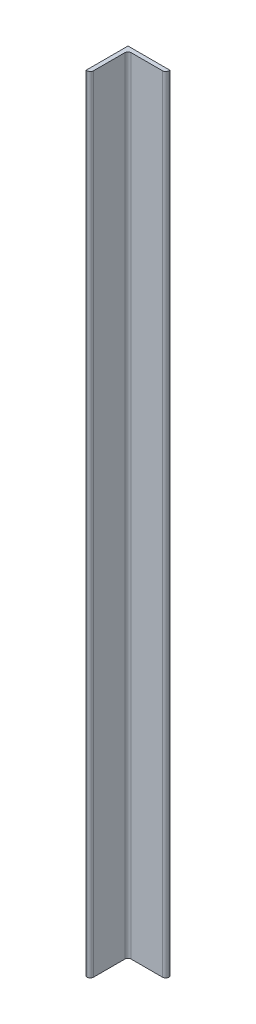
ISO-10303-21;
HEADER;
FILE_DESCRIPTION(('STEP AP214'),'2;1');
FILE_NAME('part.step','',(''),(''),'','','');
FILE_SCHEMA(('AUTOMOTIVE_DESIGN { 1 0 10303 214 1 1 1 1 }'));
ENDSEC;
DATA;
#1=APPLICATION_CONTEXT('core data for automotive mechanical design processes');
#2=APPLICATION_PROTOCOL_DEFINITION('international standard','automotive_design',2000,#1);
#3=PRODUCT_CONTEXT('',#1,'mechanical');
#4=PRODUCT('Part','Part','',(#3));
#5=PRODUCT_RELATED_PRODUCT_CATEGORY('part','',(#4));
#6=PRODUCT_DEFINITION_FORMATION('','',#4);
#7=PRODUCT_DEFINITION_CONTEXT('part definition',#1,'design');
#8=PRODUCT_DEFINITION('design','',#6,#7);
#9=PRODUCT_DEFINITION_SHAPE('','',#8);
#10=(LENGTH_UNIT() NAMED_UNIT(*) SI_UNIT(.MILLI.,.METRE.));
#11=(NAMED_UNIT(*) PLANE_ANGLE_UNIT() SI_UNIT($,.RADIAN.));
#12=(NAMED_UNIT(*) SI_UNIT($,.STERADIAN.) SOLID_ANGLE_UNIT());
#13=UNCERTAINTY_MEASURE_WITH_UNIT(LENGTH_MEASURE(1.E-05),#10,'distance_accuracy_value','');
#14=(GEOMETRIC_REPRESENTATION_CONTEXT(3) GLOBAL_UNCERTAINTY_ASSIGNED_CONTEXT((#13)) GLOBAL_UNIT_ASSIGNED_CONTEXT((#10,
#11,#12)) REPRESENTATION_CONTEXT('',''));
#15=CARTESIAN_POINT('',(0.,0.,0.));
#16=DIRECTION('',(0.,0.,1.));
#17=DIRECTION('',(1.,0.,0.));
#18=AXIS2_PLACEMENT_3D('',#15,#16,#17);
#19=CARTESIAN_POINT('',(-27.499872144952,750.,-28.2131532770167));
#20=DIRECTION('',(-1.,0.,0.));
#21=DIRECTION('',(0.,0.,1.));
#22=AXIS2_PLACEMENT_3D('',#19,#20,#21);
#23=PLANE('',#22);
#24=DIRECTION('',(0.,0.,-1.));
#25=VECTOR('',#24,1.);
#26=CARTESIAN_POINT('',(-27.499872144952,0.,-28.2131532770167));
#27=LINE('',#26,#25);
#28=CARTESIAN_POINT('',(-27.499872144952,0.,-28.2131532770167));
#29=VERTEX_POINT('',#28);
#30=CARTESIAN_POINT('',(-27.499872144952,0.,-29.2131532770167));
#31=VERTEX_POINT('',#30);
#32=EDGE_CURVE('E147',#29,#31,#27,.T.);
#33=ORIENTED_EDGE('',*,*,#32,.T.);
#34=DIRECTION('',(0.,-1.,0.));
#35=VECTOR('',#34,1.);
#36=CARTESIAN_POINT('',(-27.499872144952,750.,-29.2131532770167));
#37=LINE('',#36,#35);
#38=CARTESIAN_POINT('',(-27.499872144952,750.,-29.2131532770167));
#39=VERTEX_POINT('',#38);
#40=EDGE_CURVE('E13',#39,#31,#37,.T.);
#41=ORIENTED_EDGE('',*,*,#40,.F.);
#42=DIRECTION('',(0.,0.,-1.));
#43=VECTOR('',#42,1.);
#44=CARTESIAN_POINT('',(-27.499872144952,750.,-28.2131532770167));
#45=LINE('',#44,#43);
#46=CARTESIAN_POINT('',(-27.499872144952,750.,-28.2131532770167));
#47=VERTEX_POINT('',#46);
#48=EDGE_CURVE('E163',#47,#39,#45,.T.);
#49=ORIENTED_EDGE('',*,*,#48,.F.);
#50=DIRECTION('',(0.,-1.,0.));
#51=VECTOR('',#50,1.);
#52=CARTESIAN_POINT('',(-27.499872144952,750.,-28.2131532770167));
#53=LINE('',#52,#51);
#54=EDGE_CURVE('E143',#47,#29,#53,.T.);
#55=ORIENTED_EDGE('',*,*,#54,.T.);
#56=EDGE_LOOP('',(#33,#41,#49,#55));
#57=FACE_BOUND('',#56,.T.);
#58=ADVANCED_FACE('F45',(#57),#23,.F.);
#59=CARTESIAN_POINT('',(-27.499872144952,750.,-29.2131532770167));
#60=DIRECTION('',(0.,0.,1.));
#61=DIRECTION('',(1.,0.,0.));
#62=AXIS2_PLACEMENT_3D('',#59,#60,#61);
#63=PLANE('',#62);
#64=DIRECTION('',(-1.,0.,0.));
#65=VECTOR('',#64,1.);
#66=CARTESIAN_POINT('',(-27.499872144952,0.,-29.2131532770167));
#67=LINE('',#66,#65);
#68=CARTESIAN_POINT('',(-67.499872144952,0.,-29.2131532770166));
#69=VERTEX_POINT('',#68);
#70=EDGE_CURVE('E150',#31,#69,#67,.T.);
#71=ORIENTED_EDGE('',*,*,#70,.T.);
#72=DIRECTION('',(0.,-1.,0.));
#73=VECTOR('',#72,1.);
#74=CARTESIAN_POINT('',(-67.499872144952,750.,-29.2131532770166));
#75=LINE('',#74,#73);
#76=CARTESIAN_POINT('',(-67.499872144952,750.,-29.2131532770166));
#77=VERTEX_POINT('',#76);
#78=EDGE_CURVE('E53',#77,#69,#75,.T.);
#79=ORIENTED_EDGE('',*,*,#78,.F.);
#80=DIRECTION('',(-1.,0.,0.));
#81=VECTOR('',#80,1.);
#82=CARTESIAN_POINT('',(-27.499872144952,750.,-29.2131532770167));
#83=LINE('',#82,#81);
#84=EDGE_CURVE('E107',#39,#77,#83,.T.);
#85=ORIENTED_EDGE('',*,*,#84,.F.);
#86=ORIENTED_EDGE('',*,*,#40,.T.);
#87=EDGE_LOOP('',(#71,#79,#85,#86));
#88=FACE_BOUND('',#87,.T.);
#89=ADVANCED_FACE('F206',(#88),#63,.F.);
#90=CARTESIAN_POINT('',(-67.499872144952,750.,-29.2131532770166));
#91=DIRECTION('',(1.,0.,0.));
#92=DIRECTION('',(0.,0.,-1.));
#93=AXIS2_PLACEMENT_3D('',#90,#91,#92);
#94=PLANE('',#93);
#95=DIRECTION('',(0.,0.,1.));
#96=VECTOR('',#95,1.);
#97=CARTESIAN_POINT('',(-67.499872144952,0.,-29.2131532770166));
#98=LINE('',#97,#96);
#99=CARTESIAN_POINT('',(-67.499872144956,0.,10.7868467229834));
#100=VERTEX_POINT('',#99);
#101=EDGE_CURVE('E152',#69,#100,#98,.T.);
#102=ORIENTED_EDGE('',*,*,#101,.T.);
#103=DIRECTION('',(0.,-1.,0.));
#104=VECTOR('',#103,1.);
#105=CARTESIAN_POINT('',(-67.499872144956,750.,10.7868467229834));
#106=LINE('',#105,#104);
#107=CARTESIAN_POINT('',(-67.499872144956,750.,10.7868467229834));
#108=VERTEX_POINT('',#107);
#109=EDGE_CURVE('E173',#108,#100,#106,.T.);
#110=ORIENTED_EDGE('',*,*,#109,.F.);
#111=DIRECTION('',(0.,0.,1.));
#112=VECTOR('',#111,1.);
#113=CARTESIAN_POINT('',(-67.499872144952,750.,-29.2131532770166));
#114=LINE('',#113,#112);
#115=EDGE_CURVE('E181',#77,#108,#114,.T.);
#116=ORIENTED_EDGE('',*,*,#115,.F.);
#117=ORIENTED_EDGE('',*,*,#78,.T.);
#118=EDGE_LOOP('',(#102,#110,#116,#117));
#119=FACE_BOUND('',#118,.T.);
#120=ADVANCED_FACE('F179',(#119),#94,.F.);
#121=CARTESIAN_POINT('',(-67.499872144956,750.,10.7868467229834));
#122=DIRECTION('',(0.,0.,-1.));
#123=DIRECTION('',(-1.,0.,0.));
#124=AXIS2_PLACEMENT_3D('',#121,#122,#123);
#125=PLANE('',#124);
#126=DIRECTION('',(1.,0.,0.));
#127=VECTOR('',#126,1.);
#128=CARTESIAN_POINT('',(-67.499872144956,0.,10.7868467229834));
#129=LINE('',#128,#127);
#130=CARTESIAN_POINT('',(-66.4998721449561,0.,10.7868467229834));
#131=VERTEX_POINT('',#130);
#132=EDGE_CURVE('E154',#100,#131,#129,.T.);
#133=ORIENTED_EDGE('',*,*,#132,.T.);
#134=DIRECTION('',(0.,-1.,0.));
#135=VECTOR('',#134,1.);
#136=CARTESIAN_POINT('',(-66.4998721449561,750.,10.7868467229834));
#137=LINE('',#136,#135);
#138=CARTESIAN_POINT('',(-66.4998721449561,750.,10.7868467229834));
#139=VERTEX_POINT('',#138);
#140=EDGE_CURVE('E170',#139,#131,#137,.T.);
#141=ORIENTED_EDGE('',*,*,#140,.F.);
#142=DIRECTION('',(1.,0.,0.));
#143=VECTOR('',#142,1.);
#144=CARTESIAN_POINT('',(-67.499872144956,750.,10.7868467229834));
#145=LINE('',#144,#143);
#146=EDGE_CURVE('E197',#108,#139,#145,.T.);
#147=ORIENTED_EDGE('',*,*,#146,.F.);
#148=ORIENTED_EDGE('',*,*,#109,.T.);
#149=EDGE_LOOP('',(#133,#141,#147,#148));
#150=FACE_BOUND('',#149,.T.);
#151=ADVANCED_FACE('F190',(#150),#125,.F.);
#152=CARTESIAN_POINT('',(-66.4998721449561,750.,7.78684672298335));
#153=DIRECTION('',(0.,-1.,0.));
#154=DIRECTION('',(0.,0.,-1.));
#155=AXIS2_PLACEMENT_3D('',#152,#153,#154);
#156=CYLINDRICAL_SURFACE('',#155,3.);
#157=CARTESIAN_POINT('',(-66.4998721449561,0.,7.78684672298335));
#158=DIRECTION('',(0.,1.,0.));
#159=DIRECTION('',(0.,0.,1.));
#160=AXIS2_PLACEMENT_3D('',#157,#158,#159);
#161=CIRCLE('',#160,3.);
#162=CARTESIAN_POINT('',(-63.499872144956,0.,7.78684672298335));
#163=VERTEX_POINT('',#162);
#164=EDGE_CURVE('E156',#131,#163,#161,.T.);
#165=ORIENTED_EDGE('',*,*,#164,.T.);
#166=DIRECTION('',(0.,-1.,0.));
#167=VECTOR('',#166,1.);
#168=CARTESIAN_POINT('',(-63.499872144956,750.,7.78684672298335));
#169=LINE('',#168,#167);
#170=CARTESIAN_POINT('',(-63.499872144956,750.,7.78684672298335));
#171=VERTEX_POINT('',#170);
#172=EDGE_CURVE('E167',#171,#163,#169,.T.);
#173=ORIENTED_EDGE('',*,*,#172,.F.);
#174=CARTESIAN_POINT('',(-66.4998721449561,750.,7.78684672298335));
#175=DIRECTION('',(0.,1.,0.));
#176=DIRECTION('',(0.,0.,1.));
#177=AXIS2_PLACEMENT_3D('',#174,#175,#176);
#178=CIRCLE('',#177,3.);
#179=EDGE_CURVE('E196',#139,#171,#178,.T.);
#180=ORIENTED_EDGE('',*,*,#179,.F.);
#181=ORIENTED_EDGE('',*,*,#140,.T.);
#182=EDGE_LOOP('',(#165,#173,#180,#181));
#183=FACE_BOUND('',#182,.T.);
#184=ADVANCED_FACE('F194',(#183),#156,.T.);
#185=CARTESIAN_POINT('',(-63.499872144956,750.,7.78684672298335));
#186=DIRECTION('',(-1.,0.,0.));
#187=DIRECTION('',(0.,0.,1.));
#188=AXIS2_PLACEMENT_3D('',#185,#186,#187);
#189=PLANE('',#188);
#190=DIRECTION('',(0.,0.,-1.));
#191=VECTOR('',#190,1.);
#192=CARTESIAN_POINT('',(-63.499872144956,0.,7.78684672298335));
#193=LINE('',#192,#191);
#194=CARTESIAN_POINT('',(-63.4998721449562,0.,-22.2131532770167));
#195=VERTEX_POINT('',#194);
#196=EDGE_CURVE('E158',#163,#195,#193,.T.);
#197=ORIENTED_EDGE('',*,*,#196,.T.);
#198=DIRECTION('',(0.,-1.,0.));
#199=VECTOR('',#198,1.);
#200=CARTESIAN_POINT('',(-63.4998721449562,750.,-22.2131532770167));
#201=LINE('',#200,#199);
#202=CARTESIAN_POINT('',(-63.4998721449562,750.,-22.2131532770167));
#203=VERTEX_POINT('',#202);
#204=EDGE_CURVE('E138',#203,#195,#201,.T.);
#205=ORIENTED_EDGE('',*,*,#204,.F.);
#206=DIRECTION('',(0.,0.,-1.));
#207=VECTOR('',#206,1.);
#208=CARTESIAN_POINT('',(-63.499872144956,750.,7.78684672298335));
#209=LINE('',#208,#207);
#210=EDGE_CURVE('E129',#171,#203,#209,.T.);
#211=ORIENTED_EDGE('',*,*,#210,.F.);
#212=ORIENTED_EDGE('',*,*,#172,.T.);
#213=EDGE_LOOP('',(#197,#205,#211,#212));
#214=FACE_BOUND('',#213,.T.);
#215=ADVANCED_FACE('F218',(#214),#189,.F.);
#216=CARTESIAN_POINT('',(-60.4998721449561,750.,-22.2131532770167));
#217=DIRECTION('',(0.,-1.,0.));
#218=DIRECTION('',(0.,0.,-1.));
#219=AXIS2_PLACEMENT_3D('',#216,#217,#218);
#220=CYLINDRICAL_SURFACE('',#219,3.);
#221=CARTESIAN_POINT('',(-60.4998721449561,0.,-22.2131532770167));
#222=DIRECTION('',(0.,-1.,0.));
#223=DIRECTION('',(0.,0.,-1.));
#224=AXIS2_PLACEMENT_3D('',#221,#222,#223);
#225=CIRCLE('',#224,3.);
#226=CARTESIAN_POINT('',(-60.4998721449552,0.,-25.2131532770167));
#227=VERTEX_POINT('',#226);
#228=EDGE_CURVE('E137',#195,#227,#225,.T.);
#229=ORIENTED_EDGE('',*,*,#228,.T.);
#230=DIRECTION('',(0.,-1.,0.));
#231=VECTOR('',#230,1.);
#232=CARTESIAN_POINT('',(-60.4998721449552,750.,-25.2131532770167));
#233=LINE('',#232,#231);
#234=CARTESIAN_POINT('',(-60.4998721449552,750.,-25.2131532770167));
#235=VERTEX_POINT('',#234);
#236=EDGE_CURVE('E134',#235,#227,#233,.T.);
#237=ORIENTED_EDGE('',*,*,#236,.F.);
#238=CARTESIAN_POINT('',(-60.4998721449561,750.,-22.2131532770167));
#239=DIRECTION('',(0.,-1.,0.));
#240=DIRECTION('',(0.,0.,-1.));
#241=AXIS2_PLACEMENT_3D('',#238,#239,#240);
#242=CIRCLE('',#241,3.);
#243=EDGE_CURVE('E123',#203,#235,#242,.T.);
#244=ORIENTED_EDGE('',*,*,#243,.F.);
#245=ORIENTED_EDGE('',*,*,#204,.T.);
#246=EDGE_LOOP('',(#229,#237,#244,#245));
#247=FACE_BOUND('',#246,.T.);
#248=ADVANCED_FACE('F135',(#247),#220,.F.);
#249=CARTESIAN_POINT('',(-60.4998721449552,750.,-25.2131532770167));
#250=DIRECTION('',(0.,0.,-1.));
#251=DIRECTION('',(-1.,0.,0.));
#252=AXIS2_PLACEMENT_3D('',#249,#250,#251);
#253=PLANE('',#252);
#254=DIRECTION('',(1.,0.,0.));
#255=VECTOR('',#254,1.);
#256=CARTESIAN_POINT('',(-60.4998721449552,0.,-25.2131532770167));
#257=LINE('',#256,#255);
#258=CARTESIAN_POINT('',(-30.4998721449552,0.,-25.2131532770167));
#259=VERTEX_POINT('',#258);
#260=EDGE_CURVE('E93',#227,#259,#257,.T.);
#261=ORIENTED_EDGE('',*,*,#260,.T.);
#262=DIRECTION('',(0.,-1.,0.));
#263=VECTOR('',#262,1.);
#264=CARTESIAN_POINT('',(-30.4998721449552,750.,-25.2131532770167));
#265=LINE('',#264,#263);
#266=CARTESIAN_POINT('',(-30.4998721449552,750.,-25.2131532770167));
#267=VERTEX_POINT('',#266);
#268=EDGE_CURVE('E139',#267,#259,#265,.T.);
#269=ORIENTED_EDGE('',*,*,#268,.F.);
#270=DIRECTION('',(1.,0.,0.));
#271=VECTOR('',#270,1.);
#272=CARTESIAN_POINT('',(-60.4998721449552,750.,-25.2131532770167));
#273=LINE('',#272,#271);
#274=EDGE_CURVE('E127',#235,#267,#273,.T.);
#275=ORIENTED_EDGE('',*,*,#274,.F.);
#276=ORIENTED_EDGE('',*,*,#236,.T.);
#277=EDGE_LOOP('',(#261,#269,#275,#276));
#278=FACE_BOUND('',#277,.T.);
#279=ADVANCED_FACE('F141',(#278),#253,.F.);
#280=CARTESIAN_POINT('',(-30.4998721449519,750.,-28.2131532770167));
#281=DIRECTION('',(0.,-1.,0.));
#282=DIRECTION('',(0.,0.,-1.));
#283=AXIS2_PLACEMENT_3D('',#280,#281,#282);
#284=CYLINDRICAL_SURFACE('',#283,3.);
#285=CARTESIAN_POINT('',(-30.4998721449519,0.,-28.2131532770167));
#286=DIRECTION('',(0.,1.,0.));
#287=DIRECTION('',(0.,0.,1.));
#288=AXIS2_PLACEMENT_3D('',#285,#286,#287);
#289=CIRCLE('',#288,3.);
#290=EDGE_CURVE('E99',#259,#29,#289,.T.);
#291=ORIENTED_EDGE('',*,*,#290,.T.);
#292=ORIENTED_EDGE('',*,*,#54,.F.);
#293=CARTESIAN_POINT('',(-30.4998721449519,750.,-28.2131532770167));
#294=DIRECTION('',(0.,1.,0.));
#295=DIRECTION('',(0.,0.,1.));
#296=AXIS2_PLACEMENT_3D('',#293,#294,#295);
#297=CIRCLE('',#296,3.);
#298=EDGE_CURVE('E61',#267,#47,#297,.T.);
#299=ORIENTED_EDGE('',*,*,#298,.F.);
#300=ORIENTED_EDGE('',*,*,#268,.T.);
#301=EDGE_LOOP('',(#291,#292,#299,#300));
#302=FACE_BOUND('',#301,.T.);
#303=ADVANCED_FACE('F226',(#302),#284,.T.);
#304=CARTESIAN_POINT('',(-66.4998721449561,750.,7.78684672298335));
#305=DIRECTION('',(0.,1.,0.));
#306=DIRECTION('',(0.,0.,1.));
#307=AXIS2_PLACEMENT_3D('',#304,#305,#306);
#308=PLANE('',#307);
#309=ORIENTED_EDGE('',*,*,#48,.T.);
#310=ORIENTED_EDGE('',*,*,#84,.T.);
#311=ORIENTED_EDGE('',*,*,#115,.T.);
#312=ORIENTED_EDGE('',*,*,#146,.T.);
#313=ORIENTED_EDGE('',*,*,#179,.T.);
#314=ORIENTED_EDGE('',*,*,#210,.T.);
#315=ORIENTED_EDGE('',*,*,#243,.T.);
#316=ORIENTED_EDGE('',*,*,#274,.T.);
#317=ORIENTED_EDGE('',*,*,#298,.T.);
#318=EDGE_LOOP('',(#309,#310,#311,#312,#313,#314,#315,#316,#317));
#319=FACE_BOUND('',#318,.T.);
#320=ADVANCED_FACE('F125',(#319),#308,.T.);
#321=CARTESIAN_POINT('',(-66.4998721449561,0.,7.78684672298335));
#322=DIRECTION('',(0.,1.,0.));
#323=DIRECTION('',(0.,0.,1.));
#324=AXIS2_PLACEMENT_3D('',#321,#322,#323);
#325=PLANE('',#324);
#326=ORIENTED_EDGE('',*,*,#32,.F.);
#327=ORIENTED_EDGE('',*,*,#290,.F.);
#328=ORIENTED_EDGE('',*,*,#260,.F.);
#329=ORIENTED_EDGE('',*,*,#228,.F.);
#330=ORIENTED_EDGE('',*,*,#196,.F.);
#331=ORIENTED_EDGE('',*,*,#164,.F.);
#332=ORIENTED_EDGE('',*,*,#132,.F.);
#333=ORIENTED_EDGE('',*,*,#101,.F.);
#334=ORIENTED_EDGE('',*,*,#70,.F.);
#335=EDGE_LOOP('',(#326,#327,#328,#329,#330,#331,#332,#333,#334));
#336=FACE_BOUND('',#335,.T.);
#337=ADVANCED_FACE('F185',(#336),#325,.F.);
#338=CLOSED_SHELL('',(#58,#89,#120,#151,#184,#215,#248,#279,#303,#320,#337));
#339=MANIFOLD_SOLID_BREP('B2',#338);
#340=ADVANCED_BREP_SHAPE_REPRESENTATION('',(#18,#339),#14);
#341=SHAPE_DEFINITION_REPRESENTATION(#9,#340);
ENDSEC;
END-ISO-10303-21;
